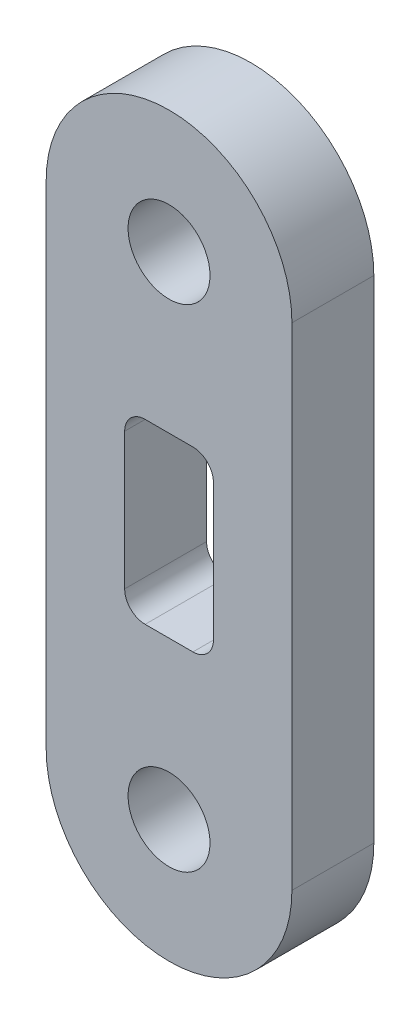
ISO-10303-21;
HEADER;
FILE_DESCRIPTION(('STEP AP214'),'2;1');
FILE_NAME('part.step','',(''),(''),'','','');
FILE_SCHEMA(('AUTOMOTIVE_DESIGN { 1 0 10303 214 1 1 1 1 }'));
ENDSEC;
DATA;
#1=APPLICATION_CONTEXT('core data for automotive mechanical design processes');
#2=APPLICATION_PROTOCOL_DEFINITION('international standard','automotive_design',2000,#1);
#3=PRODUCT_CONTEXT('',#1,'mechanical');
#4=PRODUCT('Part','Part','',(#3));
#5=PRODUCT_RELATED_PRODUCT_CATEGORY('part','',(#4));
#6=PRODUCT_DEFINITION_FORMATION('','',#4);
#7=PRODUCT_DEFINITION_CONTEXT('part definition',#1,'design');
#8=PRODUCT_DEFINITION('design','',#6,#7);
#9=PRODUCT_DEFINITION_SHAPE('','',#8);
#10=(LENGTH_UNIT() NAMED_UNIT(*) SI_UNIT(.MILLI.,.METRE.));
#11=(NAMED_UNIT(*) PLANE_ANGLE_UNIT() SI_UNIT($,.RADIAN.));
#12=(NAMED_UNIT(*) SI_UNIT($,.STERADIAN.) SOLID_ANGLE_UNIT());
#13=UNCERTAINTY_MEASURE_WITH_UNIT(LENGTH_MEASURE(1.E-05),#10,'distance_accuracy_value','');
#14=(GEOMETRIC_REPRESENTATION_CONTEXT(3) GLOBAL_UNCERTAINTY_ASSIGNED_CONTEXT((#13)) GLOBAL_UNIT_ASSIGNED_CONTEXT((#10,
#11,#12)) REPRESENTATION_CONTEXT('',''));
#15=CARTESIAN_POINT('',(0.,0.,0.));
#16=DIRECTION('',(0.,0.,1.));
#17=DIRECTION('',(1.,0.,0.));
#18=AXIS2_PLACEMENT_3D('',#15,#16,#17);
#19=CARTESIAN_POINT('',(208.7507761496,152.428489513,3.));
#20=DIRECTION('',(0.,0.,1.));
#21=DIRECTION('',(1.,0.,0.));
#22=AXIS2_PLACEMENT_3D('',#19,#20,#21);
#23=PLANE('',#22);
#24=CARTESIAN_POINT('',(208.7507761496,170.428489513,3.));
#25=DIRECTION('',(0.,0.,1.));
#26=DIRECTION('',(1.,0.,0.));
#27=AXIS2_PLACEMENT_3D('',#24,#25,#26);
#28=CIRCLE('',#27,1.5);
#29=CARTESIAN_POINT('',(210.2507761496,170.428489513,3.));
#30=VERTEX_POINT('',#29);
#31=EDGE_CURVE('E187',#30,#30,#28,.T.);
#32=ORIENTED_EDGE('',*,*,#31,.F.);
#33=EDGE_LOOP('',(#32));
#34=FACE_BOUND('',#33,.T.);
#35=CARTESIAN_POINT('',(208.7507761496,152.428489513,3.));
#36=DIRECTION('',(0.,0.,1.));
#37=DIRECTION('',(1.,0.,0.));
#38=AXIS2_PLACEMENT_3D('',#35,#36,#37);
#39=CIRCLE('',#38,4.5);
#40=CARTESIAN_POINT('',(204.2507761496,152.428489513,3.));
#41=VERTEX_POINT('',#40);
#42=CARTESIAN_POINT('',(213.2507761496,152.428489513,3.));
#43=VERTEX_POINT('',#42);
#44=EDGE_CURVE('E199',#41,#43,#39,.T.);
#45=ORIENTED_EDGE('',*,*,#44,.T.);
#46=DIRECTION('',(0.,1.,0.));
#47=VECTOR('',#46,1.);
#48=CARTESIAN_POINT('',(213.2507761496,152.428489513,3.));
#49=LINE('',#48,#47);
#50=CARTESIAN_POINT('',(213.2507761496,170.428489513,3.));
#51=VERTEX_POINT('',#50);
#52=EDGE_CURVE('E202',#43,#51,#49,.T.);
#53=ORIENTED_EDGE('',*,*,#52,.T.);
#54=CARTESIAN_POINT('',(208.7507761496,170.428489513,3.));
#55=DIRECTION('',(0.,0.,1.));
#56=DIRECTION('',(1.,0.,0.));
#57=AXIS2_PLACEMENT_3D('',#54,#55,#56);
#58=CIRCLE('',#57,4.5);
#59=CARTESIAN_POINT('',(204.2507761496,170.428489513,3.));
#60=VERTEX_POINT('',#59);
#61=EDGE_CURVE('E205',#51,#60,#58,.T.);
#62=ORIENTED_EDGE('',*,*,#61,.T.);
#63=DIRECTION('',(0.,-1.,0.));
#64=VECTOR('',#63,1.);
#65=CARTESIAN_POINT('',(204.2507761496,170.428489513,3.));
#66=LINE('',#65,#64);
#67=EDGE_CURVE('E207',#60,#41,#66,.T.);
#68=ORIENTED_EDGE('',*,*,#67,.T.);
#69=EDGE_LOOP('',(#45,#53,#62,#68));
#70=FACE_BOUND('',#69,.T.);
#71=CARTESIAN_POINT('',(208.7507761496,152.428489513,3.));
#72=DIRECTION('',(0.,0.,1.));
#73=DIRECTION('',(1.,0.,0.));
#74=AXIS2_PLACEMENT_3D('',#71,#72,#73);
#75=CIRCLE('',#74,1.5);
#76=CARTESIAN_POINT('',(210.2507761496,152.428489513,3.));
#77=VERTEX_POINT('',#76);
#78=EDGE_CURVE('E193',#77,#77,#75,.T.);
#79=ORIENTED_EDGE('',*,*,#78,.F.);
#80=EDGE_LOOP('',(#79));
#81=FACE_BOUND('',#80,.T.);
#82=DIRECTION('',(0.,-1.,0.));
#83=VECTOR('',#82,1.);
#84=CARTESIAN_POINT('',(207.1257761496,158.928489513,3.));
#85=LINE('',#84,#83);
#86=CARTESIAN_POINT('',(207.1257761496,163.928489513,3.));
#87=VERTEX_POINT('',#86);
#88=CARTESIAN_POINT('',(207.1257761496,158.928489513,3.));
#89=VERTEX_POINT('',#88);
#90=EDGE_CURVE('E130',#87,#89,#85,.T.);
#91=ORIENTED_EDGE('',*,*,#90,.F.);
#92=CARTESIAN_POINT('',(207.8757761496,163.928489513,3.));
#93=DIRECTION('',(0.,0.,1.));
#94=DIRECTION('',(1.,0.,0.));
#95=AXIS2_PLACEMENT_3D('',#92,#93,#94);
#96=CIRCLE('',#95,0.750000000000001);
#97=CARTESIAN_POINT('',(207.8757761496,164.678489513,3.));
#98=VERTEX_POINT('',#97);
#99=EDGE_CURVE('E122',#98,#87,#96,.T.);
#100=ORIENTED_EDGE('',*,*,#99,.F.);
#101=DIRECTION('',(-1.,0.,0.));
#102=VECTOR('',#101,1.);
#103=CARTESIAN_POINT('',(207.8757761496,164.678489513,3.));
#104=LINE('',#103,#102);
#105=CARTESIAN_POINT('',(209.6257761496,164.678489513,3.));
#106=VERTEX_POINT('',#105);
#107=EDGE_CURVE('E155',#106,#98,#104,.T.);
#108=ORIENTED_EDGE('',*,*,#107,.F.);
#109=CARTESIAN_POINT('',(209.6257761496,163.928489513,3.));
#110=DIRECTION('',(0.,0.,1.));
#111=DIRECTION('',(1.,0.,0.));
#112=AXIS2_PLACEMENT_3D('',#109,#110,#111);
#113=CIRCLE('',#112,0.750000000000001);
#114=CARTESIAN_POINT('',(210.3757761496,163.928489513,3.));
#115=VERTEX_POINT('',#114);
#116=EDGE_CURVE('E153',#115,#106,#113,.T.);
#117=ORIENTED_EDGE('',*,*,#116,.F.);
#118=DIRECTION('',(0.,1.,0.));
#119=VECTOR('',#118,1.);
#120=CARTESIAN_POINT('',(210.3757761496,163.928489513,3.));
#121=LINE('',#120,#119);
#122=CARTESIAN_POINT('',(210.3757761496,158.928489513,3.));
#123=VERTEX_POINT('',#122);
#124=EDGE_CURVE('E151',#123,#115,#121,.T.);
#125=ORIENTED_EDGE('',*,*,#124,.F.);
#126=CARTESIAN_POINT('',(209.6257761496,158.928489513,3.));
#127=DIRECTION('',(0.,0.,1.));
#128=DIRECTION('',(1.,0.,0.));
#129=AXIS2_PLACEMENT_3D('',#126,#127,#128);
#130=CIRCLE('',#129,0.750000000000001);
#131=CARTESIAN_POINT('',(209.6257761496,158.178489513,3.));
#132=VERTEX_POINT('',#131);
#133=EDGE_CURVE('E149',#132,#123,#130,.T.);
#134=ORIENTED_EDGE('',*,*,#133,.F.);
#135=DIRECTION('',(1.,0.,0.));
#136=VECTOR('',#135,1.);
#137=CARTESIAN_POINT('',(209.6257761496,158.178489513,3.));
#138=LINE('',#137,#136);
#139=CARTESIAN_POINT('',(207.8757761496,158.178489513,3.));
#140=VERTEX_POINT('',#139);
#141=EDGE_CURVE('E145',#140,#132,#138,.T.);
#142=ORIENTED_EDGE('',*,*,#141,.F.);
#143=CARTESIAN_POINT('',(207.8757761496,158.928489513,3.));
#144=DIRECTION('',(0.,0.,1.));
#145=DIRECTION('',(1.,0.,0.));
#146=AXIS2_PLACEMENT_3D('',#143,#144,#145);
#147=CIRCLE('',#146,0.750000000000001);
#148=EDGE_CURVE('E143',#89,#140,#147,.T.);
#149=ORIENTED_EDGE('',*,*,#148,.F.);
#150=EDGE_LOOP('',(#91,#100,#108,#117,#125,#134,#142,#149));
#151=FACE_BOUND('',#150,.T.);
#152=ADVANCED_FACE('F33',(#34,#70,#81,#151),#23,.T.);
#153=CARTESIAN_POINT('',(208.7507761496,152.428489513,0.));
#154=DIRECTION('',(0.,0.,1.));
#155=DIRECTION('',(1.,0.,0.));
#156=AXIS2_PLACEMENT_3D('',#153,#154,#155);
#157=PLANE('',#156);
#158=CARTESIAN_POINT('',(208.7507761496,170.428489513,0.));
#159=DIRECTION('',(0.,0.,1.));
#160=DIRECTION('',(1.,0.,0.));
#161=AXIS2_PLACEMENT_3D('',#158,#159,#160);
#162=CIRCLE('',#161,1.5);
#163=CARTESIAN_POINT('',(210.2507761496,170.428489513,0.));
#164=VERTEX_POINT('',#163);
#165=EDGE_CURVE('E138',#164,#164,#162,.T.);
#166=ORIENTED_EDGE('',*,*,#165,.T.);
#167=EDGE_LOOP('',(#166));
#168=FACE_BOUND('',#167,.T.);
#169=CARTESIAN_POINT('',(208.7507761496,152.428489513,0.));
#170=DIRECTION('',(0.,0.,1.));
#171=DIRECTION('',(1.,0.,0.));
#172=AXIS2_PLACEMENT_3D('',#169,#170,#171);
#173=CIRCLE('',#172,4.5);
#174=CARTESIAN_POINT('',(204.2507761496,152.428489513,0.));
#175=VERTEX_POINT('',#174);
#176=CARTESIAN_POINT('',(213.2507761496,152.428489513,0.));
#177=VERTEX_POINT('',#176);
#178=EDGE_CURVE('E196',#175,#177,#173,.T.);
#179=ORIENTED_EDGE('',*,*,#178,.F.);
#180=DIRECTION('',(0.,-1.,0.));
#181=VECTOR('',#180,1.);
#182=CARTESIAN_POINT('',(204.2507761496,170.428489513,0.));
#183=LINE('',#182,#181);
#184=CARTESIAN_POINT('',(204.2507761496,170.428489513,0.));
#185=VERTEX_POINT('',#184);
#186=EDGE_CURVE('E203',#185,#175,#183,.T.);
#187=ORIENTED_EDGE('',*,*,#186,.F.);
#188=CARTESIAN_POINT('',(208.7507761496,170.428489513,0.));
#189=DIRECTION('',(0.,0.,1.));
#190=DIRECTION('',(1.,0.,0.));
#191=AXIS2_PLACEMENT_3D('',#188,#189,#190);
#192=CIRCLE('',#191,4.5);
#193=CARTESIAN_POINT('',(213.2507761496,170.428489513,0.));
#194=VERTEX_POINT('',#193);
#195=EDGE_CURVE('E214',#194,#185,#192,.T.);
#196=ORIENTED_EDGE('',*,*,#195,.F.);
#197=DIRECTION('',(0.,1.,0.));
#198=VECTOR('',#197,1.);
#199=CARTESIAN_POINT('',(213.2507761496,152.428489513,0.));
#200=LINE('',#199,#198);
#201=EDGE_CURVE('E212',#177,#194,#200,.T.);
#202=ORIENTED_EDGE('',*,*,#201,.F.);
#203=EDGE_LOOP('',(#179,#187,#196,#202));
#204=FACE_BOUND('',#203,.T.);
#205=CARTESIAN_POINT('',(208.7507761496,152.428489513,0.));
#206=DIRECTION('',(0.,0.,1.));
#207=DIRECTION('',(1.,0.,0.));
#208=AXIS2_PLACEMENT_3D('',#205,#206,#207);
#209=CIRCLE('',#208,1.5);
#210=CARTESIAN_POINT('',(210.2507761496,152.428489513,0.));
#211=VERTEX_POINT('',#210);
#212=EDGE_CURVE('E190',#211,#211,#209,.T.);
#213=ORIENTED_EDGE('',*,*,#212,.T.);
#214=EDGE_LOOP('',(#213));
#215=FACE_BOUND('',#214,.T.);
#216=CARTESIAN_POINT('',(207.8757761496,163.928489513,0.));
#217=DIRECTION('',(0.,0.,1.));
#218=DIRECTION('',(1.,0.,0.));
#219=AXIS2_PLACEMENT_3D('',#216,#217,#218);
#220=CIRCLE('',#219,0.750000000000001);
#221=CARTESIAN_POINT('',(207.8757761496,164.678489513,0.));
#222=VERTEX_POINT('',#221);
#223=CARTESIAN_POINT('',(207.1257761496,163.928489513,0.));
#224=VERTEX_POINT('',#223);
#225=EDGE_CURVE('E56',#222,#224,#220,.T.);
#226=ORIENTED_EDGE('',*,*,#225,.T.);
#227=DIRECTION('',(0.,-1.,0.));
#228=VECTOR('',#227,1.);
#229=CARTESIAN_POINT('',(207.1257761496,158.928489513,0.));
#230=LINE('',#229,#228);
#231=CARTESIAN_POINT('',(207.1257761496,158.928489513,0.));
#232=VERTEX_POINT('',#231);
#233=EDGE_CURVE('E137',#224,#232,#230,.T.);
#234=ORIENTED_EDGE('',*,*,#233,.T.);
#235=CARTESIAN_POINT('',(207.8757761496,158.928489513,0.));
#236=DIRECTION('',(0.,0.,1.));
#237=DIRECTION('',(1.,0.,0.));
#238=AXIS2_PLACEMENT_3D('',#235,#236,#237);
#239=CIRCLE('',#238,0.750000000000001);
#240=CARTESIAN_POINT('',(207.8757761496,158.178489513,0.));
#241=VERTEX_POINT('',#240);
#242=EDGE_CURVE('E159',#232,#241,#239,.T.);
#243=ORIENTED_EDGE('',*,*,#242,.T.);
#244=DIRECTION('',(1.,0.,0.));
#245=VECTOR('',#244,1.);
#246=CARTESIAN_POINT('',(209.6257761496,158.178489513,0.));
#247=LINE('',#246,#245);
#248=CARTESIAN_POINT('',(209.6257761496,158.178489513,0.));
#249=VERTEX_POINT('',#248);
#250=EDGE_CURVE('E162',#241,#249,#247,.T.);
#251=ORIENTED_EDGE('',*,*,#250,.T.);
#252=CARTESIAN_POINT('',(209.6257761496,158.928489513,0.));
#253=DIRECTION('',(0.,0.,1.));
#254=DIRECTION('',(1.,0.,0.));
#255=AXIS2_PLACEMENT_3D('',#252,#253,#254);
#256=CIRCLE('',#255,0.750000000000001);
#257=CARTESIAN_POINT('',(210.3757761496,158.928489513,0.));
#258=VERTEX_POINT('',#257);
#259=EDGE_CURVE('E165',#249,#258,#256,.T.);
#260=ORIENTED_EDGE('',*,*,#259,.T.);
#261=DIRECTION('',(0.,1.,0.));
#262=VECTOR('',#261,1.);
#263=CARTESIAN_POINT('',(210.3757761496,163.928489513,0.));
#264=LINE('',#263,#262);
#265=CARTESIAN_POINT('',(210.3757761496,163.928489513,0.));
#266=VERTEX_POINT('',#265);
#267=EDGE_CURVE('E168',#258,#266,#264,.T.);
#268=ORIENTED_EDGE('',*,*,#267,.T.);
#269=CARTESIAN_POINT('',(209.6257761496,163.928489513,0.));
#270=DIRECTION('',(0.,0.,1.));
#271=DIRECTION('',(1.,0.,0.));
#272=AXIS2_PLACEMENT_3D('',#269,#270,#271);
#273=CIRCLE('',#272,0.750000000000001);
#274=CARTESIAN_POINT('',(209.6257761496,164.678489513,0.));
#275=VERTEX_POINT('',#274);
#276=EDGE_CURVE('E171',#266,#275,#273,.T.);
#277=ORIENTED_EDGE('',*,*,#276,.T.);
#278=DIRECTION('',(-1.,0.,0.));
#279=VECTOR('',#278,1.);
#280=CARTESIAN_POINT('',(207.8757761496,164.678489513,0.));
#281=LINE('',#280,#279);
#282=EDGE_CURVE('E131',#275,#222,#281,.T.);
#283=ORIENTED_EDGE('',*,*,#282,.T.);
#284=EDGE_LOOP('',(#226,#234,#243,#251,#260,#268,#277,#283));
#285=FACE_BOUND('',#284,.T.);
#286=ADVANCED_FACE('F232',(#168,#204,#215,#285),#157,.F.);
#287=CARTESIAN_POINT('',(208.7507761496,152.428489513,3.));
#288=DIRECTION('',(0.,0.,-1.));
#289=DIRECTION('',(-1.,0.,0.));
#290=AXIS2_PLACEMENT_3D('',#287,#288,#289);
#291=CYLINDRICAL_SURFACE('',#290,4.5);
#292=ORIENTED_EDGE('',*,*,#178,.T.);
#293=DIRECTION('',(0.,0.,-1.));
#294=VECTOR('',#293,1.);
#295=CARTESIAN_POINT('',(213.2507761496,152.428489513,3.));
#296=LINE('',#295,#294);
#297=EDGE_CURVE('E11',#43,#177,#296,.T.);
#298=ORIENTED_EDGE('',*,*,#297,.F.);
#299=ORIENTED_EDGE('',*,*,#44,.F.);
#300=DIRECTION('',(0.,0.,-1.));
#301=VECTOR('',#300,1.);
#302=CARTESIAN_POINT('',(204.2507761496,152.428489513,3.));
#303=LINE('',#302,#301);
#304=EDGE_CURVE('E209',#41,#175,#303,.T.);
#305=ORIENTED_EDGE('',*,*,#304,.T.);
#306=EDGE_LOOP('',(#292,#298,#299,#305));
#307=FACE_BOUND('',#306,.T.);
#308=ADVANCED_FACE('F35',(#307),#291,.T.);
#309=CARTESIAN_POINT('',(213.2507761496,152.428489513,3.));
#310=DIRECTION('',(-1.,0.,0.));
#311=DIRECTION('',(0.,0.,1.));
#312=AXIS2_PLACEMENT_3D('',#309,#310,#311);
#313=PLANE('',#312);
#314=ORIENTED_EDGE('',*,*,#201,.T.);
#315=DIRECTION('',(0.,0.,-1.));
#316=VECTOR('',#315,1.);
#317=CARTESIAN_POINT('',(213.2507761496,170.428489513,3.));
#318=LINE('',#317,#316);
#319=EDGE_CURVE('E41',#51,#194,#318,.T.);
#320=ORIENTED_EDGE('',*,*,#319,.F.);
#321=ORIENTED_EDGE('',*,*,#52,.F.);
#322=ORIENTED_EDGE('',*,*,#297,.T.);
#323=EDGE_LOOP('',(#314,#320,#321,#322));
#324=FACE_BOUND('',#323,.T.);
#325=ADVANCED_FACE('F243',(#324),#313,.F.);
#326=CARTESIAN_POINT('',(208.7507761496,170.428489513,3.));
#327=DIRECTION('',(0.,0.,-1.));
#328=DIRECTION('',(-1.,0.,0.));
#329=AXIS2_PLACEMENT_3D('',#326,#327,#328);
#330=CYLINDRICAL_SURFACE('',#329,4.5);
#331=ORIENTED_EDGE('',*,*,#195,.T.);
#332=DIRECTION('',(0.,0.,-1.));
#333=VECTOR('',#332,1.);
#334=CARTESIAN_POINT('',(204.2507761496,170.428489513,3.));
#335=LINE('',#334,#333);
#336=EDGE_CURVE('E219',#60,#185,#335,.T.);
#337=ORIENTED_EDGE('',*,*,#336,.F.);
#338=ORIENTED_EDGE('',*,*,#61,.F.);
#339=ORIENTED_EDGE('',*,*,#319,.T.);
#340=EDGE_LOOP('',(#331,#337,#338,#339));
#341=FACE_BOUND('',#340,.T.);
#342=ADVANCED_FACE('F226',(#341),#330,.T.);
#343=CARTESIAN_POINT('',(204.2507761496,170.428489513,3.));
#344=DIRECTION('',(1.,0.,0.));
#345=DIRECTION('',(0.,0.,-1.));
#346=AXIS2_PLACEMENT_3D('',#343,#344,#345);
#347=PLANE('',#346);
#348=ORIENTED_EDGE('',*,*,#186,.T.);
#349=ORIENTED_EDGE('',*,*,#304,.F.);
#350=ORIENTED_EDGE('',*,*,#67,.F.);
#351=ORIENTED_EDGE('',*,*,#336,.T.);
#352=EDGE_LOOP('',(#348,#349,#350,#351));
#353=FACE_BOUND('',#352,.T.);
#354=ADVANCED_FACE('F236',(#353),#347,.F.);
#355=CARTESIAN_POINT('',(208.7507761496,152.428489513,3.));
#356=DIRECTION('',(0.,0.,-1.));
#357=DIRECTION('',(-1.,0.,0.));
#358=AXIS2_PLACEMENT_3D('',#355,#356,#357);
#359=CYLINDRICAL_SURFACE('',#358,1.5);
#360=ORIENTED_EDGE('',*,*,#78,.T.);
#361=EDGE_LOOP('',(#360));
#362=FACE_BOUND('',#361,.T.);
#363=ORIENTED_EDGE('',*,*,#212,.F.);
#364=EDGE_LOOP('',(#363));
#365=FACE_BOUND('',#364,.T.);
#366=ADVANCED_FACE('F260',(#362,#365),#359,.F.);
#367=CARTESIAN_POINT('',(208.7507761496,170.428489513,3.));
#368=DIRECTION('',(0.,0.,-1.));
#369=DIRECTION('',(-1.,0.,0.));
#370=AXIS2_PLACEMENT_3D('',#367,#368,#369);
#371=CYLINDRICAL_SURFACE('',#370,1.5);
#372=ORIENTED_EDGE('',*,*,#31,.T.);
#373=EDGE_LOOP('',(#372));
#374=FACE_BOUND('',#373,.T.);
#375=ORIENTED_EDGE('',*,*,#165,.F.);
#376=EDGE_LOOP('',(#375));
#377=FACE_BOUND('',#376,.T.);
#378=ADVANCED_FACE('F267',(#374,#377),#371,.F.);
#379=CARTESIAN_POINT('',(207.8757761496,163.928489513,3.));
#380=DIRECTION('',(0.,0.,-1.));
#381=DIRECTION('',(-1.,0.,0.));
#382=AXIS2_PLACEMENT_3D('',#379,#380,#381);
#383=CYLINDRICAL_SURFACE('',#382,0.750000000000001);
#384=ORIENTED_EDGE('',*,*,#225,.F.);
#385=DIRECTION('',(0.,0.,-1.));
#386=VECTOR('',#385,1.);
#387=CARTESIAN_POINT('',(207.8757761496,164.678489513,3.));
#388=LINE('',#387,#386);
#389=EDGE_CURVE('E126',#98,#222,#388,.T.);
#390=ORIENTED_EDGE('',*,*,#389,.F.);
#391=ORIENTED_EDGE('',*,*,#99,.T.);
#392=DIRECTION('',(0.,0.,-1.));
#393=VECTOR('',#392,1.);
#394=CARTESIAN_POINT('',(207.1257761496,163.928489513,3.));
#395=LINE('',#394,#393);
#396=EDGE_CURVE('E125',#87,#224,#395,.T.);
#397=ORIENTED_EDGE('',*,*,#396,.T.);
#398=EDGE_LOOP('',(#384,#390,#391,#397));
#399=FACE_BOUND('',#398,.T.);
#400=ADVANCED_FACE('F124',(#399),#383,.F.);
#401=CARTESIAN_POINT('',(207.1257761496,158.928489513,3.));
#402=DIRECTION('',(1.,0.,0.));
#403=DIRECTION('',(0.,0.,-1.));
#404=AXIS2_PLACEMENT_3D('',#401,#402,#403);
#405=PLANE('',#404);
#406=ORIENTED_EDGE('',*,*,#233,.F.);
#407=ORIENTED_EDGE('',*,*,#396,.F.);
#408=ORIENTED_EDGE('',*,*,#90,.T.);
#409=DIRECTION('',(0.,0.,-1.));
#410=VECTOR('',#409,1.);
#411=CARTESIAN_POINT('',(207.1257761496,158.928489513,3.));
#412=LINE('',#411,#410);
#413=EDGE_CURVE('E139',#89,#232,#412,.T.);
#414=ORIENTED_EDGE('',*,*,#413,.T.);
#415=EDGE_LOOP('',(#406,#407,#408,#414));
#416=FACE_BOUND('',#415,.T.);
#417=ADVANCED_FACE('F134',(#416),#405,.T.);
#418=CARTESIAN_POINT('',(207.8757761496,158.928489513,3.));
#419=DIRECTION('',(0.,0.,-1.));
#420=DIRECTION('',(-1.,0.,0.));
#421=AXIS2_PLACEMENT_3D('',#418,#419,#420);
#422=CYLINDRICAL_SURFACE('',#421,0.750000000000001);
#423=ORIENTED_EDGE('',*,*,#242,.F.);
#424=ORIENTED_EDGE('',*,*,#413,.F.);
#425=ORIENTED_EDGE('',*,*,#148,.T.);
#426=DIRECTION('',(0.,0.,-1.));
#427=VECTOR('',#426,1.);
#428=CARTESIAN_POINT('',(207.8757761496,158.178489513,3.));
#429=LINE('',#428,#427);
#430=EDGE_CURVE('E184',#140,#241,#429,.T.);
#431=ORIENTED_EDGE('',*,*,#430,.T.);
#432=EDGE_LOOP('',(#423,#424,#425,#431));
#433=FACE_BOUND('',#432,.T.);
#434=ADVANCED_FACE('F299',(#433),#422,.F.);
#435=CARTESIAN_POINT('',(209.6257761496,158.178489513,3.));
#436=DIRECTION('',(0.,1.,0.));
#437=DIRECTION('',(0.,0.,1.));
#438=AXIS2_PLACEMENT_3D('',#435,#436,#437);
#439=PLANE('',#438);
#440=ORIENTED_EDGE('',*,*,#250,.F.);
#441=ORIENTED_EDGE('',*,*,#430,.F.);
#442=ORIENTED_EDGE('',*,*,#141,.T.);
#443=DIRECTION('',(0.,0.,-1.));
#444=VECTOR('',#443,1.);
#445=CARTESIAN_POINT('',(209.6257761496,158.178489513,3.));
#446=LINE('',#445,#444);
#447=EDGE_CURVE('E182',#132,#249,#446,.T.);
#448=ORIENTED_EDGE('',*,*,#447,.T.);
#449=EDGE_LOOP('',(#440,#441,#442,#448));
#450=FACE_BOUND('',#449,.T.);
#451=ADVANCED_FACE('F296',(#450),#439,.T.);
#452=CARTESIAN_POINT('',(209.6257761496,158.928489513,3.));
#453=DIRECTION('',(0.,0.,-1.));
#454=DIRECTION('',(-1.,0.,0.));
#455=AXIS2_PLACEMENT_3D('',#452,#453,#454);
#456=CYLINDRICAL_SURFACE('',#455,0.750000000000001);
#457=ORIENTED_EDGE('',*,*,#259,.F.);
#458=ORIENTED_EDGE('',*,*,#447,.F.);
#459=ORIENTED_EDGE('',*,*,#133,.T.);
#460=DIRECTION('',(0.,0.,-1.));
#461=VECTOR('',#460,1.);
#462=CARTESIAN_POINT('',(210.3757761496,158.928489513,3.));
#463=LINE('',#462,#461);
#464=EDGE_CURVE('E180',#123,#258,#463,.T.);
#465=ORIENTED_EDGE('',*,*,#464,.T.);
#466=EDGE_LOOP('',(#457,#458,#459,#465));
#467=FACE_BOUND('',#466,.T.);
#468=ADVANCED_FACE('F291',(#467),#456,.F.);
#469=CARTESIAN_POINT('',(210.3757761496,163.928489513,3.));
#470=DIRECTION('',(-1.,0.,0.));
#471=DIRECTION('',(0.,0.,1.));
#472=AXIS2_PLACEMENT_3D('',#469,#470,#471);
#473=PLANE('',#472);
#474=ORIENTED_EDGE('',*,*,#267,.F.);
#475=ORIENTED_EDGE('',*,*,#464,.F.);
#476=ORIENTED_EDGE('',*,*,#124,.T.);
#477=DIRECTION('',(0.,0.,-1.));
#478=VECTOR('',#477,1.);
#479=CARTESIAN_POINT('',(210.3757761496,163.928489513,3.));
#480=LINE('',#479,#478);
#481=EDGE_CURVE('E178',#115,#266,#480,.T.);
#482=ORIENTED_EDGE('',*,*,#481,.T.);
#483=EDGE_LOOP('',(#474,#475,#476,#482));
#484=FACE_BOUND('',#483,.T.);
#485=ADVANCED_FACE('F287',(#484),#473,.T.);
#486=CARTESIAN_POINT('',(209.6257761496,163.928489513,3.));
#487=DIRECTION('',(0.,0.,-1.));
#488=DIRECTION('',(-1.,0.,0.));
#489=AXIS2_PLACEMENT_3D('',#486,#487,#488);
#490=CYLINDRICAL_SURFACE('',#489,0.750000000000001);
#491=ORIENTED_EDGE('',*,*,#276,.F.);
#492=ORIENTED_EDGE('',*,*,#481,.F.);
#493=ORIENTED_EDGE('',*,*,#116,.T.);
#494=DIRECTION('',(0.,0.,-1.));
#495=VECTOR('',#494,1.);
#496=CARTESIAN_POINT('',(209.6257761496,164.678489513,3.));
#497=LINE('',#496,#495);
#498=EDGE_CURVE('E48',#106,#275,#497,.T.);
#499=ORIENTED_EDGE('',*,*,#498,.T.);
#500=EDGE_LOOP('',(#491,#492,#493,#499));
#501=FACE_BOUND('',#500,.T.);
#502=ADVANCED_FACE('F284',(#501),#490,.F.);
#503=CARTESIAN_POINT('',(207.8757761496,164.678489513,3.));
#504=DIRECTION('',(0.,-1.,0.));
#505=DIRECTION('',(0.,0.,-1.));
#506=AXIS2_PLACEMENT_3D('',#503,#504,#505);
#507=PLANE('',#506);
#508=ORIENTED_EDGE('',*,*,#282,.F.);
#509=ORIENTED_EDGE('',*,*,#498,.F.);
#510=ORIENTED_EDGE('',*,*,#107,.T.);
#511=ORIENTED_EDGE('',*,*,#389,.T.);
#512=EDGE_LOOP('',(#508,#509,#510,#511));
#513=FACE_BOUND('',#512,.T.);
#514=ADVANCED_FACE('F278',(#513),#507,.T.);
#515=CLOSED_SHELL('',(#152,#286,#308,#325,#342,#354,#366,#378,#400,#417,#434,#451,#468,#485,
#502,#514));
#516=MANIFOLD_SOLID_BREP('B2',#515);
#517=ADVANCED_BREP_SHAPE_REPRESENTATION('',(#18,#516),#14);
#518=SHAPE_DEFINITION_REPRESENTATION(#9,#517);
ENDSEC;
END-ISO-10303-21;
